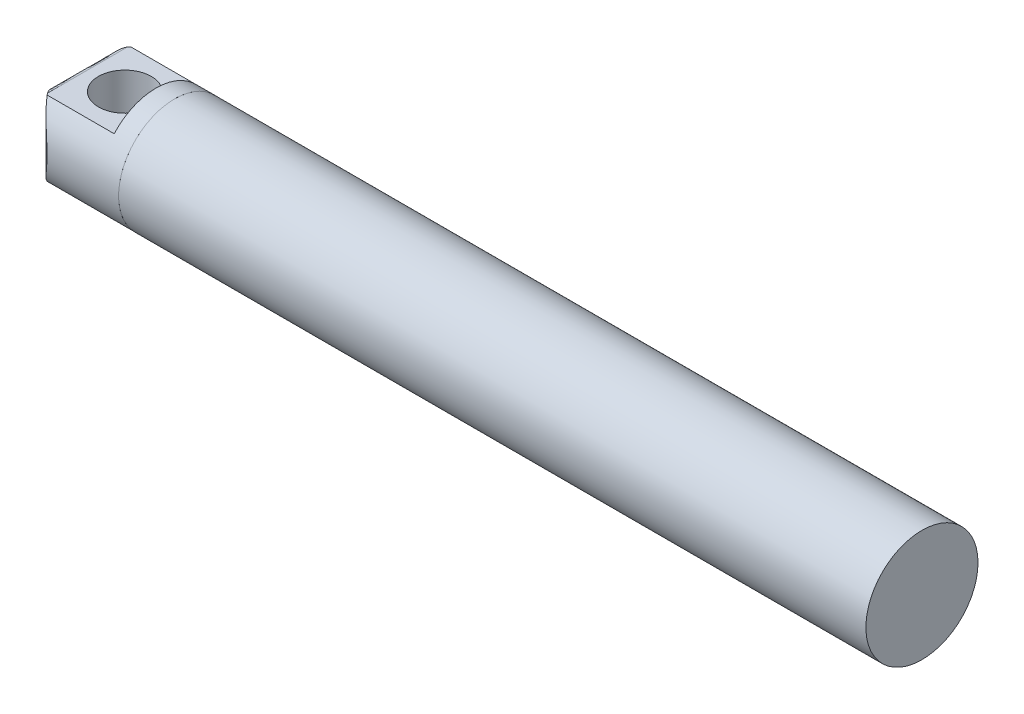
ISO-10303-21;
HEADER;
FILE_DESCRIPTION(('STEP AP214'),'2;1');
FILE_NAME('part.step','',(''),(''),'','','');
FILE_SCHEMA(('AUTOMOTIVE_DESIGN { 1 0 10303 214 1 1 1 1 }'));
ENDSEC;
DATA;
#1=APPLICATION_CONTEXT('core data for automotive mechanical design processes');
#2=APPLICATION_PROTOCOL_DEFINITION('international standard','automotive_design',2000,#1);
#3=PRODUCT_CONTEXT('',#1,'mechanical');
#4=PRODUCT('Part','Part','',(#3));
#5=PRODUCT_RELATED_PRODUCT_CATEGORY('part','',(#4));
#6=PRODUCT_DEFINITION_FORMATION('','',#4);
#7=PRODUCT_DEFINITION_CONTEXT('part definition',#1,'design');
#8=PRODUCT_DEFINITION('design','',#6,#7);
#9=PRODUCT_DEFINITION_SHAPE('','',#8);
#10=(LENGTH_UNIT() NAMED_UNIT(*) SI_UNIT(.MILLI.,.METRE.));
#11=(NAMED_UNIT(*) PLANE_ANGLE_UNIT() SI_UNIT($,.RADIAN.));
#12=(NAMED_UNIT(*) SI_UNIT($,.STERADIAN.) SOLID_ANGLE_UNIT());
#13=UNCERTAINTY_MEASURE_WITH_UNIT(LENGTH_MEASURE(1.E-05),#10,'distance_accuracy_value','');
#14=(GEOMETRIC_REPRESENTATION_CONTEXT(3) GLOBAL_UNCERTAINTY_ASSIGNED_CONTEXT((#13)) GLOBAL_UNIT_ASSIGNED_CONTEXT((#10,
#11,#12)) REPRESENTATION_CONTEXT('',''));
#15=CARTESIAN_POINT('',(0.,0.,0.));
#16=DIRECTION('',(0.,0.,1.));
#17=DIRECTION('',(1.,0.,0.));
#18=AXIS2_PLACEMENT_3D('',#15,#16,#17);
#19=CARTESIAN_POINT('',(6.87386354243376,-3.,0.));
#20=DIRECTION('',(0.,-1.,0.));
#21=DIRECTION('',(0.,0.,-1.));
#22=AXIS2_PLACEMENT_3D('',#19,#20,#21);
#23=PLANE('',#22);
#24=CARTESIAN_POINT('',(-4.,-3.,0.));
#25=DIRECTION('',(0.,-1.,0.));
#26=DIRECTION('',(0.,0.,-1.));
#27=AXIS2_PLACEMENT_3D('',#24,#25,#26);
#28=CIRCLE('',#27,2.125);
#29=CARTESIAN_POINT('',(-4.,-3.,-2.125));
#30=VERTEX_POINT('',#29);
#31=EDGE_CURVE('E138',#30,#30,#28,.T.);
#32=ORIENTED_EDGE('',*,*,#31,.F.);
#33=EDGE_LOOP('',(#32));
#34=FACE_BOUND('',#33,.T.);
#35=CARTESIAN_POINT('',(-2.375,-3.,0.));
#36=DIRECTION('',(0.,-1.,0.));
#37=DIRECTION('',(0.,0.,-1.));
#38=AXIS2_PLACEMENT_3D('',#35,#36,#37);
#39=CIRCLE('',#38,5.625);
#40=CARTESIAN_POINT('',(-7.,-3.,3.20156211871642));
#41=VERTEX_POINT('',#40);
#42=CARTESIAN_POINT('',(-6.89059796704711,-3.,3.35410196624968));
#43=VERTEX_POINT('',#42);
#44=EDGE_CURVE('E341',#41,#43,#39,.F.);
#45=ORIENTED_EDGE('',*,*,#44,.F.);
#46=CARTESIAN_POINT('',(-7.,-3.,-4.95));
#47=CARTESIAN_POINT('',(-7.,-3.,-1.65));
#48=CARTESIAN_POINT('',(-7.,-3.,1.65));
#49=CARTESIAN_POINT('',(-7.,-3.,4.95));
#50=(BOUNDED_CURVE() B_SPLINE_CURVE(3,(#46,#47,#48,#49),.UNSPECIFIED.,.F.,
.F.) B_SPLINE_CURVE_WITH_KNOTS((4,4),(-0.00495,0.00495),
.UNSPECIFIED.) CURVE() GEOMETRIC_REPRESENTATION_ITEM() RATIONAL_B_SPLINE_CURVE((1.,1.,1.,1.)) REPRESENTATION_ITEM(''));
#51=CARTESIAN_POINT('',(-7.,-3.,-3.20156211871642));
#52=VERTEX_POINT('',#51);
#53=EDGE_CURVE('E135',#41,#52,#50,.F.);
#54=ORIENTED_EDGE('',*,*,#53,.T.);
#55=CARTESIAN_POINT('',(-2.375,-3.,0.));
#56=DIRECTION('',(0.,-1.,0.));
#57=DIRECTION('',(0.,0.,-1.));
#58=AXIS2_PLACEMENT_3D('',#55,#56,#57);
#59=CIRCLE('',#58,5.625);
#60=CARTESIAN_POINT('',(-6.89059796704711,-3.,-3.35410196624968));
#61=VERTEX_POINT('',#60);
#62=EDGE_CURVE('E115',#61,#52,#59,.F.);
#63=ORIENTED_EDGE('',*,*,#62,.F.);
#64=DIRECTION('',(-1.,0.,0.));
#65=VECTOR('',#64,1.);
#66=CARTESIAN_POINT('',(6.87386354243376,-3.,-3.35410196624968));
#67=LINE('',#66,#65);
#68=CARTESIAN_POINT('',(-1.5,-3.,-3.35410196624968));
#69=VERTEX_POINT('',#68);
#70=EDGE_CURVE('E111',#69,#61,#67,.T.);
#71=ORIENTED_EDGE('',*,*,#70,.F.);
#72=DIRECTION('',(0.,0.,-1.));
#73=VECTOR('',#72,1.);
#74=CARTESIAN_POINT('',(-1.5,-3.,0.));
#75=LINE('',#74,#73);
#76=CARTESIAN_POINT('',(-1.5,-3.,3.35410196624968));
#77=VERTEX_POINT('',#76);
#78=EDGE_CURVE('E99',#77,#69,#75,.T.);
#79=ORIENTED_EDGE('',*,*,#78,.F.);
#80=DIRECTION('',(-1.,0.,0.));
#81=VECTOR('',#80,1.);
#82=CARTESIAN_POINT('',(6.87386354243376,-3.,3.35410196624968));
#83=LINE('',#82,#81);
#84=EDGE_CURVE('E107',#77,#43,#83,.T.);
#85=ORIENTED_EDGE('',*,*,#84,.T.);
#86=EDGE_LOOP('',(#45,#54,#63,#71,#79,#85));
#87=FACE_BOUND('',#86,.T.);
#88=ADVANCED_FACE('F57',(#34,#87),#23,.T.);
#89=CARTESIAN_POINT('',(6.87386354243376,3.,0.));
#90=DIRECTION('',(0.,-1.,0.));
#91=DIRECTION('',(0.,0.,-1.));
#92=AXIS2_PLACEMENT_3D('',#89,#90,#91);
#93=PLANE('',#92);
#94=CARTESIAN_POINT('',(-4.,3.,0.));
#95=DIRECTION('',(0.,-1.,0.));
#96=DIRECTION('',(0.,0.,-1.));
#97=AXIS2_PLACEMENT_3D('',#94,#95,#96);
#98=CIRCLE('',#97,2.125);
#99=CARTESIAN_POINT('',(-4.,3.,-2.125));
#100=VERTEX_POINT('',#99);
#101=EDGE_CURVE('E118',#100,#100,#98,.T.);
#102=ORIENTED_EDGE('',*,*,#101,.T.);
#103=EDGE_LOOP('',(#102));
#104=FACE_BOUND('',#103,.T.);
#105=CARTESIAN_POINT('',(-7.,3.,4.95));
#106=CARTESIAN_POINT('',(-7.,3.,1.65));
#107=CARTESIAN_POINT('',(-7.,3.,-1.65));
#108=CARTESIAN_POINT('',(-7.,3.,-4.95));
#109=(BOUNDED_CURVE() B_SPLINE_CURVE(3,(#105,#106,#107,#108),.UNSPECIFIED.,.F.,
.F.) B_SPLINE_CURVE_WITH_KNOTS((4,4),(-0.00495,0.00495),
.UNSPECIFIED.) CURVE() GEOMETRIC_REPRESENTATION_ITEM() RATIONAL_B_SPLINE_CURVE((1.,1.,1.,1.)) REPRESENTATION_ITEM(''));
#110=CARTESIAN_POINT('',(-7.,3.,-3.20156211871643));
#111=VERTEX_POINT('',#110);
#112=CARTESIAN_POINT('',(-7.,3.,3.20156211871642));
#113=VERTEX_POINT('',#112);
#114=EDGE_CURVE('E310',#111,#113,#109,.F.);
#115=ORIENTED_EDGE('',*,*,#114,.T.);
#116=CARTESIAN_POINT('',(-2.375,3.,0.));
#117=DIRECTION('',(0.,-1.,0.));
#118=DIRECTION('',(0.,0.,-1.));
#119=AXIS2_PLACEMENT_3D('',#116,#117,#118);
#120=CIRCLE('',#119,5.625);
#121=CARTESIAN_POINT('',(-6.89059796704711,3.,3.35410196624968));
#122=VERTEX_POINT('',#121);
#123=EDGE_CURVE('E78',#113,#122,#120,.F.);
#124=ORIENTED_EDGE('',*,*,#123,.T.);
#125=DIRECTION('',(-1.,0.,0.));
#126=VECTOR('',#125,1.);
#127=CARTESIAN_POINT('',(6.87386354243376,3.,3.35410196624968));
#128=LINE('',#127,#126);
#129=CARTESIAN_POINT('',(-1.5,3.,3.35410196624968));
#130=VERTEX_POINT('',#129);
#131=EDGE_CURVE('E126',#130,#122,#128,.T.);
#132=ORIENTED_EDGE('',*,*,#131,.F.);
#133=DIRECTION('',(0.,0.,-1.));
#134=VECTOR('',#133,1.);
#135=CARTESIAN_POINT('',(-1.5,3.,0.));
#136=LINE('',#135,#134);
#137=CARTESIAN_POINT('',(-1.5,3.,-3.35410196624968));
#138=VERTEX_POINT('',#137);
#139=EDGE_CURVE('E87',#130,#138,#136,.T.);
#140=ORIENTED_EDGE('',*,*,#139,.T.);
#141=DIRECTION('',(-1.,0.,0.));
#142=VECTOR('',#141,1.);
#143=CARTESIAN_POINT('',(6.87386354243376,3.,-3.35410196624968));
#144=LINE('',#143,#142);
#145=CARTESIAN_POINT('',(-6.89059796704711,3.,-3.35410196624968));
#146=VERTEX_POINT('',#145);
#147=EDGE_CURVE('E124',#138,#146,#144,.T.);
#148=ORIENTED_EDGE('',*,*,#147,.T.);
#149=CARTESIAN_POINT('',(-2.375,3.,0.));
#150=DIRECTION('',(0.,-1.,0.));
#151=DIRECTION('',(0.,0.,-1.));
#152=AXIS2_PLACEMENT_3D('',#149,#150,#151);
#153=CIRCLE('',#152,5.625);
#154=EDGE_CURVE('E279',#146,#111,#153,.F.);
#155=ORIENTED_EDGE('',*,*,#154,.T.);
#156=EDGE_LOOP('',(#115,#124,#132,#140,#148,#155));
#157=FACE_BOUND('',#156,.T.);
#158=ADVANCED_FACE('F159',(#104,#157),#93,.F.);
#159=CARTESIAN_POINT('',(-8.,0.,0.));
#160=DIRECTION('',(1.,0.,0.));
#161=DIRECTION('',(0.,0.,-1.));
#162=AXIS2_PLACEMENT_3D('',#159,#160,#161);
#163=CYLINDRICAL_SURFACE('',#162,4.5);
#164=ORIENTED_EDGE('',*,*,#131,.T.);
#165=CARTESIAN_POINT('',(-8.,4.5,0.));
#166=CARTESIAN_POINT('',(-8.0000261661008,4.50002487156967,0.108672439922456));
#167=CARTESIAN_POINT('',(-7.99685185276276,4.4960645795516,0.217328745801081));
#168=CARTESIAN_POINT('',(-7.98429829677313,4.48036197312974,0.43364470434593));
#169=CARTESIAN_POINT('',(-7.97492328388789,4.4686249635529,0.541304985716546));
#170=CARTESIAN_POINT('',(-7.95025630920092,4.43767275327524,0.754017893882866));
#171=CARTESIAN_POINT('',(-7.93500905254759,4.41851404736611,0.859083989414262));
#172=CARTESIAN_POINT('',(-7.8989397812197,4.37303995347104,1.0666829358713));
#173=CARTESIAN_POINT('',(-7.8781170806575,4.34672368495991,1.16921547342395));
#174=CARTESIAN_POINT('',(-7.83138654367935,4.28740740578871,1.37082003697381));
#175=CARTESIAN_POINT('',(-7.80549255810958,4.25442559260534,1.46990064165043));
#176=CARTESIAN_POINT('',(-7.74907704194071,4.18217468474652,1.66438967209096));
#177=CARTESIAN_POINT('',(-7.71855384501168,4.14290332580127,1.75979675996775));
#178=CARTESIAN_POINT('',(-7.62071427086776,4.01619280840778,2.04015550086476));
#179=CARTESIAN_POINT('',(-7.54717032733247,3.91991033601592,2.21906761584285));
#180=CARTESIAN_POINT('',(-7.41400776365368,3.74208663994068,2.50300782390038));
#181=CARTESIAN_POINT('',(-7.35765928887198,3.66596359520418,2.61311577806552));
#182=CARTESIAN_POINT('',(-7.24077925728615,3.50545479990695,2.82478438679524));
#183=CARTESIAN_POINT('',(-7.18024773418259,3.42106911591153,2.92634511020561));
#184=CARTESIAN_POINT('',(-7.05616873846176,3.24448393969402,3.12100163484433));
#185=CARTESIAN_POINT('',(-6.99261353003736,3.15226387226424,3.21407372633282));
#186=CARTESIAN_POINT('',(-6.86402643681371,2.9607052493104,3.39134893405051));
#187=CARTESIAN_POINT('',(-6.79899514309824,2.86136950999452,3.47555552679283));
#188=CARTESIAN_POINT('',(-6.66786388809714,2.65416610852393,3.63632686992106));
#189=CARTESIAN_POINT('',(-6.60176339468885,2.54618779917114,3.712748629409));
#190=CARTESIAN_POINT('',(-6.47126926601441,2.32314199763701,3.8562425409141));
#191=CARTESIAN_POINT('',(-6.4068761761314,2.2080722784033,3.92331173396583));
#192=CARTESIAN_POINT('',(-6.28212790298923,1.97107666184142,4.04755486354508));
#193=CARTESIAN_POINT('',(-6.22176202835472,1.84917063997277,4.10475569649702));
#194=CARTESIAN_POINT('',(-6.1076087182825,1.59819949905376,4.20882590894756));
#195=CARTESIAN_POINT('',(-6.0538156794043,1.46914061632435,4.25570411638028));
#196=CARTESIAN_POINT('',(-5.94878886929489,1.1837991495072,4.34443093288057));
#197=CARTESIAN_POINT('',(-5.89913843095813,1.02633016672769,4.3844814767026));
#198=CARTESIAN_POINT('',(-5.83904774924775,0.784290990483122,4.43188997598468));
#199=CARTESIAN_POINT('',(-5.82142186278368,0.702693989221956,4.44557676350451));
#200=CARTESIAN_POINT('',(-5.79163831630602,0.537908696939688,4.46850787740056));
#201=CARTESIAN_POINT('',(-5.77947792321641,0.454721222996837,4.47775442432328));
#202=CARTESIAN_POINT('',(-5.76109976436353,0.286524941048153,4.49166889700138));
#203=CARTESIAN_POINT('',(-5.75493766398534,0.201506419458626,4.49629394457043));
#204=CARTESIAN_POINT('',(-5.74906972271404,0.0311215371337521,4.50069912166866));
#205=CARTESIAN_POINT('',(-5.74936356323163,-0.0542448062293438,4.50047949027422));
#206=CARTESIAN_POINT('',(-5.75639368743091,-0.224602881980737,4.49519969305009));
#207=CARTESIAN_POINT('',(-5.76313338557733,-0.309594391842028,4.49013696175948));
#208=CARTESIAN_POINT('',(-5.78271599618316,-0.478484799420624,4.47529282126764));
#209=CARTESIAN_POINT('',(-5.79556215027681,-0.562383092467276,4.4655089057669));
#210=CARTESIAN_POINT('',(-5.82919455900568,-0.741434965725223,4.43955869719676));
#211=CARTESIAN_POINT('',(-5.85090630117247,-0.836304684188569,4.42263531536983));
#212=CARTESIAN_POINT('',(-5.90054851484273,-1.02323008253987,4.38316564029135));
#213=CARTESIAN_POINT('',(-5.92848362566582,-1.1152836045149,4.36061515069935));
#214=CARTESIAN_POINT('',(-6.01991290651878,-1.38707045335151,4.28502580284268));
#215=CARTESIAN_POINT('',(-6.09096633764061,-1.56212336814309,4.22409562862079));
#216=CARTESIAN_POINT('',(-6.22506502478741,-1.85603168983297,4.10166808565762));
#217=CARTESIAN_POINT('',(-6.28555954648743,-1.97786670191742,4.04424657199999));
#218=CARTESIAN_POINT('',(-6.41040539719526,-2.21449049514367,3.91968092163188));
#219=CARTESIAN_POINT('',(-6.4747585016677,-2.32927598261877,3.85253228870846));
#220=CARTESIAN_POINT('',(-6.60522718705313,-2.55192894829102,3.70880611531807));
#221=CARTESIAN_POINT('',(-6.67134479214373,-2.65978795120054,3.63221734605303));
#222=CARTESIAN_POINT('',(-6.80350788199198,-2.86837215736219,3.46985600027281));
#223=CARTESIAN_POINT('',(-6.86955337687331,-2.96909853812568,3.38408494554434));
#224=CARTESIAN_POINT('',(-7.00179089672534,-3.1657547506825,3.20101850928736));
#225=CARTESIAN_POINT('',(-7.06793973787145,-3.26148466864229,3.10347654684732));
#226=CARTESIAN_POINT('',(-7.19701960206948,-3.44462830671523,2.89886039491093));
#227=CARTESIAN_POINT('',(-7.25995013228855,-3.53204075489422,2.79178475232449));
#228=CARTESIAN_POINT('',(-7.38094837656211,-3.69757703194077,2.56849759597405));
#229=CARTESIAN_POINT('',(-7.43902625718152,-3.77572043194652,2.45230622431923));
#230=CARTESIAN_POINT('',(-7.54892283765363,-3.92188319996621,2.21105075338405));
#231=CARTESIAN_POINT('',(-7.60074450313563,-3.98990736837166,2.08599090300591));
#232=CARTESIAN_POINT('',(-7.71705925753282,-4.14128430859407,1.7724231705272));
#233=CARTESIAN_POINT('',(-7.77759057251411,-4.21888269283898,1.57952084760284));
#234=CARTESIAN_POINT('',(-7.85332276947795,-4.31529563733404,1.28032523371139));
#235=CARTESIAN_POINT('',(-7.87604793706609,-4.34409248450541,1.17900959719902));
#236=CARTESIAN_POINT('',(-7.91608660397593,-4.39468518863303,0.973608526905847));
#237=CARTESIAN_POINT('',(-7.93340176766953,-4.41648319881818,0.869523955694167));
#238=CARTESIAN_POINT('',(-7.96501040391153,-4.45620518089249,0.639056693083048));
#239=CARTESIAN_POINT('',(-7.97808537833726,-4.47258174110641,0.512229785993068));
#240=CARTESIAN_POINT('',(-7.99120914316473,-4.48900761024307,0.320825640382829));
#241=CARTESIAN_POINT('',(-7.99450231178815,-4.49312643301584,0.256780645820061));
#242=CARTESIAN_POINT('',(-7.99889853224633,-4.49862325987034,0.128495178120196));
#243=CARTESIAN_POINT('',(-8.00000147759835,-4.50000113069439,0.0642546956310645));
#244=CARTESIAN_POINT('',(-8.,-4.5,0.));
#245=B_SPLINE_CURVE_WITH_KNOTS('',3,(#165,#166,#167,#168,#169,#170,#171,#172,#173,#174,#175,
#176,#177,#178,#179,#180,#181,#182,#183,#184,#185,#186,#187,#188,#189,#190,#191,#192,#193,#194,
#195,#196,#197,#198,#199,#200,#201,#202,#203,#204,#205,#206,#207,#208,#209,#210,#211,#212,#213,
#214,#215,#216,#217,#218,#219,#220,#221,#222,#223,#224,#225,#226,#227,#228,#229,#230,#231,#232,
#233,#234,#235,#236,#237,#238,#239,#240,#241,#242,#243,#244),.UNSPECIFIED.,.F.,.F.,(4,2,2,2,2,2,
2,2,2,2,2,2,2,2,2,2,2,2,2,2,2,2,2,2,2,2,2,2,2,2,2,2,2,2,2,2,2,2,2,4),(0.,0.325873390537367,
0.651524717634366,0.974744375261115,1.2980038134525,1.6203923679153,1.94289724593747,
2.58846980258137,3.02370253883476,3.45893176906262,3.89534162565577,4.33157970620457,
4.77476231285281,5.21808481704872,5.66017926302322,6.10189414760313,6.60960830761901,
6.86313355272992,7.11653187850242,7.37225998776166,7.62797547731773,7.88382649816316,
8.13981349038544,8.4356990444293,8.73180591406933,9.32495860391734,9.7674351449928,
10.2101168706435,10.6533303303863,11.0964704494284,11.5514441144277,12.0064872440151,
12.4605517924078,12.9144002486499,13.560943823822,13.8838717286897,14.2067001876843,
14.5915126197412,14.7842151368725,14.97692702245),.UNSPECIFIED.);
#246=EDGE_CURVE('E340',#122,#43,#245,.T.);
#247=ORIENTED_EDGE('',*,*,#246,.T.);
#248=ORIENTED_EDGE('',*,*,#84,.F.);
#249=CARTESIAN_POINT('',(-1.5,0.,0.));
#250=DIRECTION('',(-1.,0.,0.));
#251=DIRECTION('',(0.,0.,1.));
#252=AXIS2_PLACEMENT_3D('',#249,#250,#251);
#253=CIRCLE('',#252,4.5);
#254=EDGE_CURVE('E103',#77,#69,#253,.F.);
#255=ORIENTED_EDGE('',*,*,#254,.T.);
#256=ORIENTED_EDGE('',*,*,#70,.T.);
#257=CARTESIAN_POINT('',(-8.,-4.5,0.));
#258=CARTESIAN_POINT('',(-8.0000261661008,-4.50002487156967,-0.108672439922454));
#259=CARTESIAN_POINT('',(-7.99685185276276,-4.4960645795516,-0.217328745801079));
#260=CARTESIAN_POINT('',(-7.98429829677313,-4.48036197312974,-0.433644704345927));
#261=CARTESIAN_POINT('',(-7.97492328388789,-4.4686249635529,-0.541304985716544));
#262=CARTESIAN_POINT('',(-7.95025630920092,-4.43767275327524,-0.754017893882863));
#263=CARTESIAN_POINT('',(-7.93500905254759,-4.41851404736611,-0.859083989414259));
#264=CARTESIAN_POINT('',(-7.8989397812197,-4.37303995347104,-1.06668293587129));
#265=CARTESIAN_POINT('',(-7.8781170806575,-4.34672368495991,-1.16921547342395));
#266=CARTESIAN_POINT('',(-7.83138654367935,-4.28740740578871,-1.3708200369738));
#267=CARTESIAN_POINT('',(-7.80549255810958,-4.25442559260535,-1.46990064165042));
#268=CARTESIAN_POINT('',(-7.74907704194071,-4.18217468474652,-1.66438967209096));
#269=CARTESIAN_POINT('',(-7.71855384501168,-4.14290332580127,-1.75979675996775));
#270=CARTESIAN_POINT('',(-7.62071427086776,-4.01619280840779,-2.04015550086476));
#271=CARTESIAN_POINT('',(-7.54717032733247,-3.91991033601592,-2.21906761584285));
#272=CARTESIAN_POINT('',(-7.41400776365368,-3.74208663994068,-2.50300782390038));
#273=CARTESIAN_POINT('',(-7.35765928887198,-3.66596359520419,-2.61311577806552));
#274=CARTESIAN_POINT('',(-7.24077925728615,-3.50545479990695,-2.82478438679524));
#275=CARTESIAN_POINT('',(-7.18024773418259,-3.42106911591153,-2.92634511020561));
#276=CARTESIAN_POINT('',(-7.05616873846176,-3.24448393969402,-3.12100163484433));
#277=CARTESIAN_POINT('',(-6.99261353003736,-3.15226387226425,-3.21407372633282));
#278=CARTESIAN_POINT('',(-6.86402643681371,-2.9607052493104,-3.3913489340505));
#279=CARTESIAN_POINT('',(-6.79899514309824,-2.86136950999452,-3.47555552679283));
#280=CARTESIAN_POINT('',(-6.66786388809714,-2.65416610852393,-3.63632686992105));
#281=CARTESIAN_POINT('',(-6.60176339468886,-2.54618779917114,-3.712748629409));
#282=CARTESIAN_POINT('',(-6.47126926601441,-2.32314199763701,-3.8562425409141));
#283=CARTESIAN_POINT('',(-6.4068761761314,-2.2080722784033,-3.92331173396583));
#284=CARTESIAN_POINT('',(-6.28212790298923,-1.97107666184143,-4.04755486354508));
#285=CARTESIAN_POINT('',(-6.22176202835472,-1.84917063997277,-4.10475569649702));
#286=CARTESIAN_POINT('',(-6.1076087182825,-1.59819949905377,-4.20882590894756));
#287=CARTESIAN_POINT('',(-6.05381567940431,-1.46914061632435,-4.25570411638028));
#288=CARTESIAN_POINT('',(-5.94878886929489,-1.1837991495072,-4.34443093288057));
#289=CARTESIAN_POINT('',(-5.89913843095813,-1.02633016672769,-4.3844814767026));
#290=CARTESIAN_POINT('',(-5.83904774924775,-0.784290990483127,-4.43188997598468));
#291=CARTESIAN_POINT('',(-5.82142186278368,-0.70269398922196,-4.44557676350451));
#292=CARTESIAN_POINT('',(-5.79163831630602,-0.537908696939691,-4.46850787740056));
#293=CARTESIAN_POINT('',(-5.77947792321641,-0.45472122299684,-4.47775442432328));
#294=CARTESIAN_POINT('',(-5.76109976436353,-0.286524941048156,-4.49166889700138));
#295=CARTESIAN_POINT('',(-5.75493766398534,-0.201506419458629,-4.49629394457043));
#296=CARTESIAN_POINT('',(-5.74906972271404,-0.0311215371337546,-4.50069912166866));
#297=CARTESIAN_POINT('',(-5.74936356323163,0.0542448062293415,-4.50047949027422));
#298=CARTESIAN_POINT('',(-5.75639368743091,0.224602881980735,-4.49519969305009));
#299=CARTESIAN_POINT('',(-5.76313338557733,0.309594391842026,-4.49013696175948));
#300=CARTESIAN_POINT('',(-5.78271599618316,0.478484799420622,-4.47529282126764));
#301=CARTESIAN_POINT('',(-5.79556215027681,0.562383092467275,-4.4655089057669));
#302=CARTESIAN_POINT('',(-5.82919455900568,0.741434965725221,-4.43955869719676));
#303=CARTESIAN_POINT('',(-5.85090630117246,0.836304684188567,-4.42263531536983));
#304=CARTESIAN_POINT('',(-5.90054851484273,1.02323008253987,-4.38316564029135));
#305=CARTESIAN_POINT('',(-5.92848362566582,1.1152836045149,-4.36061515069935));
#306=CARTESIAN_POINT('',(-6.01991290651878,1.38707045335151,-4.28502580284268));
#307=CARTESIAN_POINT('',(-6.09096633764061,1.56212336814308,-4.22409562862079));
#308=CARTESIAN_POINT('',(-6.22506502478741,1.85603168983297,-4.10166808565762));
#309=CARTESIAN_POINT('',(-6.28555954648743,1.97786670191742,-4.044246572));
#310=CARTESIAN_POINT('',(-6.41040539719526,2.21449049514367,-3.91968092163188));
#311=CARTESIAN_POINT('',(-6.4747585016677,2.32927598261876,-3.85253228870846));
#312=CARTESIAN_POINT('',(-6.60522718705313,2.55192894829102,-3.70880611531807));
#313=CARTESIAN_POINT('',(-6.67134479214373,2.65978795120054,-3.63221734605303));
#314=CARTESIAN_POINT('',(-6.80350788199198,2.86837215736219,-3.46985600027281));
#315=CARTESIAN_POINT('',(-6.86955337687331,2.96909853812568,-3.38408494554434));
#316=CARTESIAN_POINT('',(-7.00179089672534,3.16575475068249,-3.20101850928736));
#317=CARTESIAN_POINT('',(-7.06793973787145,3.26148466864229,-3.10347654684732));
#318=CARTESIAN_POINT('',(-7.19701960206948,3.44462830671523,-2.89886039491093));
#319=CARTESIAN_POINT('',(-7.25995013228855,3.53204075489422,-2.79178475232449));
#320=CARTESIAN_POINT('',(-7.38094837656211,3.69757703194076,-2.56849759597406));
#321=CARTESIAN_POINT('',(-7.43902625718151,3.77572043194652,-2.45230622431923));
#322=CARTESIAN_POINT('',(-7.54892283765363,3.9218831999662,-2.21105075338405));
#323=CARTESIAN_POINT('',(-7.60074450313563,3.98990736837166,-2.08599090300592));
#324=CARTESIAN_POINT('',(-7.71705925753281,4.14128430859407,-1.7724231705272));
#325=CARTESIAN_POINT('',(-7.7775905725141,4.21888269283898,-1.57952084760285));
#326=CARTESIAN_POINT('',(-7.85332276947794,4.31529563733404,-1.2803252337114));
#327=CARTESIAN_POINT('',(-7.87604793706609,4.34409248450541,-1.17900959719903));
#328=CARTESIAN_POINT('',(-7.91608660397593,4.39468518863303,-0.973608526905851));
#329=CARTESIAN_POINT('',(-7.93340176766953,4.41648319881818,-0.869523955694171));
#330=CARTESIAN_POINT('',(-7.96501040391153,4.45620518089249,-0.639056693083051));
#331=CARTESIAN_POINT('',(-7.97808537833726,4.47258174110641,-0.51222978599307));
#332=CARTESIAN_POINT('',(-7.99120914316473,4.48900761024307,-0.32082564038283));
#333=CARTESIAN_POINT('',(-7.99450231178815,4.49312643301584,-0.256780645820061));
#334=CARTESIAN_POINT('',(-7.99889853224633,4.49862325987034,-0.128495178120196));
#335=CARTESIAN_POINT('',(-8.00000147759835,4.50000113069439,-0.0642546956310641));
#336=CARTESIAN_POINT('',(-8.,4.5,0.));
#337=B_SPLINE_CURVE_WITH_KNOTS('',3,(#257,#258,#259,#260,#261,#262,#263,#264,#265,#266,#267,
#268,#269,#270,#271,#272,#273,#274,#275,#276,#277,#278,#279,#280,#281,#282,#283,#284,#285,#286,
#287,#288,#289,#290,#291,#292,#293,#294,#295,#296,#297,#298,#299,#300,#301,#302,#303,#304,#305,
#306,#307,#308,#309,#310,#311,#312,#313,#314,#315,#316,#317,#318,#319,#320,#321,#322,#323,#324,
#325,#326,#327,#328,#329,#330,#331,#332,#333,#334,#335,#336),.UNSPECIFIED.,.F.,.F.,(4,2,2,2,2,2,
2,2,2,2,2,2,2,2,2,2,2,2,2,2,2,2,2,2,2,2,2,2,2,2,2,2,2,2,2,2,2,2,2,4),(0.,0.325873390537366,
0.651524717634366,0.974744375261114,1.2980038134525,1.6203923679153,1.94289724593747,
2.58846980258137,3.02370253883476,3.45893176906262,3.89534162565577,4.33157970620456,
4.77476231285281,5.21808481704872,5.66017926302322,6.10189414760313,6.60960830761901,
6.86313355272992,7.11653187850242,7.37225998776166,7.62797547731773,7.88382649816316,
8.13981349038544,8.4356990444293,8.73180591406933,9.32495860391734,9.7674351449928,
10.2101168706435,10.6533303303863,11.0964704494284,11.5514441144277,12.0064872440151,
12.4605517924078,12.9144002486499,13.560943823822,13.8838717286897,14.2067001876843,
14.5915126197412,14.7842151368725,14.97692702245),.UNSPECIFIED.);
#338=EDGE_CURVE('E285',#61,#146,#337,.T.);
#339=ORIENTED_EDGE('',*,*,#338,.T.);
#340=ORIENTED_EDGE('',*,*,#147,.F.);
#341=CARTESIAN_POINT('',(-1.5,0.,0.));
#342=DIRECTION('',(-1.,0.,0.));
#343=DIRECTION('',(0.,0.,1.));
#344=AXIS2_PLACEMENT_3D('',#341,#342,#343);
#345=CIRCLE('',#344,4.5);
#346=EDGE_CURVE('E143',#138,#130,#345,.F.);
#347=ORIENTED_EDGE('',*,*,#346,.T.);
#348=EDGE_LOOP('',(#164,#247,#248,#255,#256,#339,#340,#347));
#349=FACE_BOUND('',#348,.T.);
#350=CARTESIAN_POINT('',(0.,0.,0.));
#351=DIRECTION('',(-1.,0.,0.));
#352=DIRECTION('',(0.,0.,1.));
#353=AXIS2_PLACEMENT_3D('',#350,#351,#352);
#354=CIRCLE('',#353,4.5);
#355=CARTESIAN_POINT('',(0.,0.,4.5));
#356=VERTEX_POINT('',#355);
#357=EDGE_CURVE('E132',#356,#356,#354,.T.);
#358=ORIENTED_EDGE('',*,*,#357,.T.);
#359=EDGE_LOOP('',(#358));
#360=FACE_BOUND('',#359,.T.);
#361=ADVANCED_FACE('F121',(#349,#360),#163,.T.);
#362=CARTESIAN_POINT('',(0.,0.,0.));
#363=DIRECTION('',(-1.,0.,0.));
#364=DIRECTION('',(0.,0.,1.));
#365=AXIS2_PLACEMENT_3D('',#362,#363,#364);
#366=PLANE('',#365);
#367=ORIENTED_EDGE('',*,*,#357,.F.);
#368=EDGE_LOOP('',(#367));
#369=FACE_BOUND('',#368,.T.);
#370=ADVANCED_FACE('F174',(#369),#366,.F.);
#371=CARTESIAN_POINT('',(-1.5,0.,0.));
#372=DIRECTION('',(-1.,0.,0.));
#373=DIRECTION('',(0.,0.,1.));
#374=AXIS2_PLACEMENT_3D('',#371,#372,#373);
#375=PLANE('',#374);
#376=ORIENTED_EDGE('',*,*,#254,.F.);
#377=ORIENTED_EDGE('',*,*,#78,.T.);
#378=EDGE_LOOP('',(#376,#377));
#379=FACE_BOUND('',#378,.T.);
#380=ADVANCED_FACE('F101',(#379),#375,.T.);
#381=CARTESIAN_POINT('',(-1.5,0.,0.));
#382=DIRECTION('',(-1.,0.,0.));
#383=DIRECTION('',(0.,0.,1.));
#384=AXIS2_PLACEMENT_3D('',#381,#382,#383);
#385=PLANE('',#384);
#386=ORIENTED_EDGE('',*,*,#346,.F.);
#387=ORIENTED_EDGE('',*,*,#139,.F.);
#388=EDGE_LOOP('',(#386,#387));
#389=FACE_BOUND('',#388,.T.);
#390=ADVANCED_FACE('F170',(#389),#385,.T.);
#391=CARTESIAN_POINT('',(-4.,4.5,0.));
#392=DIRECTION('',(0.,-1.,0.));
#393=DIRECTION('',(0.,0.,-1.));
#394=AXIS2_PLACEMENT_3D('',#391,#392,#393);
#395=CYLINDRICAL_SURFACE('',#394,2.125);
#396=ORIENTED_EDGE('',*,*,#31,.T.);
#397=EDGE_LOOP('',(#396));
#398=FACE_BOUND('',#397,.T.);
#399=ORIENTED_EDGE('',*,*,#101,.F.);
#400=EDGE_LOOP('',(#399));
#401=FACE_BOUND('',#400,.T.);
#402=ADVANCED_FACE('F223',(#398,#401),#395,.F.);
#403=CARTESIAN_POINT('',(-8.,0.,-4.95));
#404=CARTESIAN_POINT('',(-8.,0.,-1.65));
#405=CARTESIAN_POINT('',(-8.,0.,1.65));
#406=CARTESIAN_POINT('',(-8.,0.,4.95));
#407=CARTESIAN_POINT('',(-8.,-3.,-4.95));
#408=CARTESIAN_POINT('',(-8.,-3.,-1.65));
#409=CARTESIAN_POINT('',(-8.,-3.,1.65));
#410=CARTESIAN_POINT('',(-8.,-3.,4.95));
#411=CARTESIAN_POINT('',(-7.,-3.,-4.95));
#412=CARTESIAN_POINT('',(-7.,-3.,-1.65));
#413=CARTESIAN_POINT('',(-7.,-3.,1.65));
#414=CARTESIAN_POINT('',(-7.,-3.,4.95));
#415=(BOUNDED_SURFACE() B_SPLINE_SURFACE(2,3,((#403,#404,#405,#406),(#407,#408,#409,#410),(#411,
#412,#413,#414)),.UNSPECIFIED.,.F.,.F.,.F.) B_SPLINE_SURFACE_WITH_KNOTS((3,3),(4,4),(0.,1.),
(-0.00495,0.00495),
.UNSPECIFIED.) GEOMETRIC_REPRESENTATION_ITEM() RATIONAL_B_SPLINE_SURFACE(((1.,1.,1.,1.),
(0.707106781186548,0.707106781186548,0.707106781186548,0.707106781186548),(1.,1.,1.,1.))) REPRESENTATION_ITEM('') SURFACE());
#416=CARTESIAN_POINT('',(-7.,-3.,3.20156211871642));
#417=CARTESIAN_POINT('',(-7.03236832458521,-3.00001999319289,3.15483054416643));
#418=CARTESIAN_POINT('',(-7.06386874306515,-2.99529017516387,3.10778414198009));
#419=CARTESIAN_POINT('',(-7.12447778880159,-2.97804493020909,3.01431650065035));
#420=CARTESIAN_POINT('',(-7.15360963568613,-2.96561909572023,2.96789426141037));
#421=CARTESIAN_POINT('',(-7.20655169438404,-2.93629868199439,2.88080890125299));
#422=CARTESIAN_POINT('',(-7.23059667417074,-2.92003294313545,2.84006603019509));
#423=CARTESIAN_POINT('',(-7.27692880176442,-2.88356602776757,2.75932648882784));
#424=CARTESIAN_POINT('',(-7.29921481451605,-2.86336233881626,2.71933031286186));
#425=CARTESIAN_POINT('',(-7.34227317244633,-2.81963324533846,2.63986417575268));
#426=CARTESIAN_POINT('',(-7.36303203412824,-2.796082643774,2.60040095158735));
#427=CARTESIAN_POINT('',(-7.40296351281597,-2.74641294937646,2.52232617407461));
#428=CARTESIAN_POINT('',(-7.42213647020755,-2.72029441035255,2.48371443928196));
#429=CARTESIAN_POINT('',(-7.46491269523587,-2.65731510478651,2.39510899989731));
#430=CARTESIAN_POINT('',(-7.48798180938816,-2.61968265861576,2.34540743952579));
#431=CARTESIAN_POINT('',(-7.53188468852034,-2.54160118646665,2.24723255441383));
#432=CARTESIAN_POINT('',(-7.55271746284007,-2.50115092522072,2.19875978120827));
#433=CARTESIAN_POINT('',(-7.61228117625529,-2.3763879334239,2.05483114828513));
#434=CARTESIAN_POINT('',(-7.64801228739268,-2.28876468818272,1.96100210881465));
#435=CARTESIAN_POINT('',(-7.71298681666845,-2.10772627413457,1.77653691849953));
#436=CARTESIAN_POINT('',(-7.74221846426807,-2.01430098286761,1.68590680654659));
#437=CARTESIAN_POINT('',(-7.79510118850916,-1.82364568093808,1.50724754652073));
#438=CARTESIAN_POINT('',(-7.81875686226426,-1.72641888208733,1.41921630856074));
#439=CARTESIAN_POINT('',(-7.8586546195411,-1.54112138526381,1.25553524990166));
#440=CARTESIAN_POINT('',(-7.87544620354656,-1.45335622231669,1.17966990299074));
#441=CARTESIAN_POINT('',(-7.90559961031484,-1.27627420658548,1.02906916096807));
#442=CARTESIAN_POINT('',(-7.91896106033807,-1.18695718629197,0.95433388948703));
#443=CARTESIAN_POINT('',(-7.95422577171523,-0.917770721614861,0.731749960185313));
#444=CARTESIAN_POINT('',(-7.97139902365735,-0.73623224981636,0.585147217190732));
#445=CARTESIAN_POINT('',(-7.98841602957159,-0.464263048635389,0.367830137520758));
#446=CARTESIAN_POINT('',(-7.99263114514254,-0.374543403861303,0.296511107133569));
#447=CARTESIAN_POINT('',(-7.99834286569715,-0.194844335828985,0.154047757419146));
#448=CARTESIAN_POINT('',(-7.99983900358965,-0.10486487059508,0.0829034702068963));
#449=CARTESIAN_POINT('',(-7.99999589070238,-0.00992276615822732,0.00784463868301938));
#450=CARTESIAN_POINT('',(-7.99999999258424,-0.00496137484307822,0.00392231466259599));
#451=CARTESIAN_POINT('',(-8.,0.,0.));
#452=B_SPLINE_CURVE_WITH_KNOTS('',3,(#416,#417,#418,#419,#420,#421,#422,#423,#424,#425,#426,
#427,#428,#429,#430,#431,#432,#433,#434,#435,#436,#437,#438,#439,#440,#441,#442,#443,#444,#445,
#446,#447,#448,#449,#450,#451),.UNSPECIFIED.,.F.,.F.,(4,2,2,2,2,2,2,2,2,2,2,2,2,2,2,2,2,4),(0.,
0.169998903161114,0.33805504188558,0.487931029101642,0.637902953210587,0.789070469602154,
0.940205455964252,1.13948197157798,1.33884640211887,1.73812101566532,2.13811293083906,
2.53777390998813,2.88935738644857,3.24097905198921,3.94248262962906,4.28653380687461,
4.63064408283287,4.64961775278576),.UNSPECIFIED.);
#453=CARTESIAN_POINT('',(-8.,0.,0.));
#454=VERTEX_POINT('',#453);
#455=EDGE_CURVE('E213',#454,#41,#452,.F.);
#456=CARTESIAN_POINT('',(-7.,-3.,-3.20156211871642));
#457=CARTESIAN_POINT('',(-7.03236832458521,-3.00001999319289,-3.15483054416642));
#458=CARTESIAN_POINT('',(-7.06386874306515,-2.99529017516387,-3.10778414198009));
#459=CARTESIAN_POINT('',(-7.12447778880159,-2.97804493020909,-3.01431650065036));
#460=CARTESIAN_POINT('',(-7.15360963568614,-2.96561909572023,-2.96789426141038));
#461=CARTESIAN_POINT('',(-7.20655169438404,-2.93629868199439,-2.880808901253));
#462=CARTESIAN_POINT('',(-7.23059667417074,-2.92003294313545,-2.84006603019509));
#463=CARTESIAN_POINT('',(-7.27692880176442,-2.88356602776757,-2.75932648882783));
#464=CARTESIAN_POINT('',(-7.29921481451605,-2.86336233881626,-2.71933031286186));
#465=CARTESIAN_POINT('',(-7.34227317244633,-2.81963324533846,-2.63986417575268));
#466=CARTESIAN_POINT('',(-7.36303203412824,-2.796082643774,-2.60040095158735));
#467=CARTESIAN_POINT('',(-7.40296351281597,-2.74641294937646,-2.5223261740746));
#468=CARTESIAN_POINT('',(-7.42213647020755,-2.72029441035254,-2.48371443928196));
#469=CARTESIAN_POINT('',(-7.46491269523588,-2.65731510478651,-2.3951089998973));
#470=CARTESIAN_POINT('',(-7.48798180938816,-2.61968265861576,-2.34540743952578));
#471=CARTESIAN_POINT('',(-7.53188468852034,-2.54160118646664,-2.24723255441383));
#472=CARTESIAN_POINT('',(-7.55271746284007,-2.50115092522071,-2.19875978120826));
#473=CARTESIAN_POINT('',(-7.61228117625529,-2.37638793342388,-2.05483114828512));
#474=CARTESIAN_POINT('',(-7.64801228739269,-2.28876468818271,-1.96100210881464));
#475=CARTESIAN_POINT('',(-7.71298681666845,-2.10772627413456,-1.77653691849951));
#476=CARTESIAN_POINT('',(-7.74221846426803,-2.0143009828676,-1.68590680654656));
#477=CARTESIAN_POINT('',(-7.7951011885092,-1.82364568093807,-1.50724754652071));
#478=CARTESIAN_POINT('',(-7.8187568622644,-1.72641888208731,-1.41921630856076));
#479=CARTESIAN_POINT('',(-7.85865461954122,-1.5411213852638,-1.25553524990167));
#480=CARTESIAN_POINT('',(-7.8754462035466,-1.45335622231667,-1.17966990299073));
#481=CARTESIAN_POINT('',(-7.90559961031482,-1.27627420658545,-1.02906916096803));
#482=CARTESIAN_POINT('',(-7.91896106033806,-1.18695718629194,-0.954333889486983));
#483=CARTESIAN_POINT('',(-7.95422577171526,-0.917770721614823,-0.731749960185269));
#484=CARTESIAN_POINT('',(-7.97139902365735,-0.736232249816278,-0.58514721719072));
#485=CARTESIAN_POINT('',(-7.98841602957159,-0.464263048635353,-0.36783013752069));
#486=CARTESIAN_POINT('',(-7.99263114514254,-0.374543403861308,-0.296511107133472));
#487=CARTESIAN_POINT('',(-7.99834286569716,-0.194844335828931,-0.154047757419165));
#488=CARTESIAN_POINT('',(-7.99983900358966,-0.104864870594928,-0.0829034702070621));
#489=CARTESIAN_POINT('',(-7.99999589070238,-0.0099227661582104,-0.00784463868303705));
#490=CARTESIAN_POINT('',(-7.99999999258424,-0.00496137484306938,-0.00392231466260529));
#491=CARTESIAN_POINT('',(-8.,0.,0.));
#492=B_SPLINE_CURVE_WITH_KNOTS('',3,(#456,#457,#458,#459,#460,#461,#462,#463,#464,#465,#466,
#467,#468,#469,#470,#471,#472,#473,#474,#475,#476,#477,#478,#479,#480,#481,#482,#483,#484,#485,
#486,#487,#488,#489,#490,#491),.UNSPECIFIED.,.F.,.F.,(4,2,2,2,2,2,2,2,2,2,2,2,2,2,2,2,2,4),(0.,
0.169998903161112,0.33805504188558,0.487931029101644,0.637902953210591,0.789070469602162,
0.940205455964262,1.13948197157799,1.33884640211889,1.73812101566534,2.13811293083908,
2.53777390998816,2.88935738644861,3.24097905198927,3.94248262962915,4.28653380687466,
4.63064408283287,4.64961775278577),.UNSPECIFIED.);
#493=EDGE_CURVE('E278',#52,#454,#492,.T.);
#494=ORIENTED_EDGE('',*,*,#455,.F.);
#495=ORIENTED_EDGE('',*,*,#493,.F.);
#496=ORIENTED_EDGE('',*,*,#53,.F.);
#497=EDGE_LOOP('',(#494,#495,#496));
#498=FACE_BOUND('',#497,.T.);
#499=ADVANCED_FACE('F216',(#498),#415,.T.);
#500=CARTESIAN_POINT('',(-8.,0.,4.95));
#501=CARTESIAN_POINT('',(-8.,0.,1.65));
#502=CARTESIAN_POINT('',(-8.,0.,-1.65));
#503=CARTESIAN_POINT('',(-8.,0.,-4.95));
#504=CARTESIAN_POINT('',(-8.,3.,4.95));
#505=CARTESIAN_POINT('',(-8.,3.,1.65));
#506=CARTESIAN_POINT('',(-8.,3.,-1.65));
#507=CARTESIAN_POINT('',(-8.,3.,-4.95));
#508=CARTESIAN_POINT('',(-7.,3.,4.95));
#509=CARTESIAN_POINT('',(-7.,3.,1.65));
#510=CARTESIAN_POINT('',(-7.,3.,-1.65));
#511=CARTESIAN_POINT('',(-7.,3.,-4.95));
#512=(BOUNDED_SURFACE() B_SPLINE_SURFACE(2,3,((#500,#501,#502,#503),(#504,#505,#506,#507),(#508,
#509,#510,#511)),.UNSPECIFIED.,.F.,.F.,.F.) B_SPLINE_SURFACE_WITH_KNOTS((3,3),(4,4),(0.,1.),
(-0.00495,0.00495),
.UNSPECIFIED.) GEOMETRIC_REPRESENTATION_ITEM() RATIONAL_B_SPLINE_SURFACE(((1.,1.,1.,1.),
(0.707106781186548,0.707106781186548,0.707106781186548,0.707106781186548),(1.,1.,1.,1.))) REPRESENTATION_ITEM('') SURFACE());
#513=CARTESIAN_POINT('',(-7.,3.,3.20156211871643));
#514=CARTESIAN_POINT('',(-7.0323683245852,3.0000199931929,3.15483054416643));
#515=CARTESIAN_POINT('',(-7.06386874306514,2.99529017516387,3.1077841419801));
#516=CARTESIAN_POINT('',(-7.12447778880158,2.97804493020909,3.01431650065036));
#517=CARTESIAN_POINT('',(-7.15360963568613,2.96561909572024,2.96789426141038));
#518=CARTESIAN_POINT('',(-7.20655169438404,2.93629868199439,2.880808901253));
#519=CARTESIAN_POINT('',(-7.23059667417074,2.92003294313545,2.84006603019509));
#520=CARTESIAN_POINT('',(-7.27692880176442,2.88356602776756,2.75932648882783));
#521=CARTESIAN_POINT('',(-7.29921481451606,2.86336233881626,2.71933031286185));
#522=CARTESIAN_POINT('',(-7.34227317244633,2.81963324533845,2.63986417575267));
#523=CARTESIAN_POINT('',(-7.36303203412824,2.79608264377399,2.60040095158735));
#524=CARTESIAN_POINT('',(-7.40296351281597,2.74641294937646,2.52232617407461));
#525=CARTESIAN_POINT('',(-7.42213647020754,2.72029441035255,2.48371443928196));
#526=CARTESIAN_POINT('',(-7.46491269523586,2.65731510478653,2.39510899989732));
#527=CARTESIAN_POINT('',(-7.48798180938815,2.61968265861578,2.3454074395258));
#528=CARTESIAN_POINT('',(-7.53188468852033,2.54160118646668,2.24723255441387));
#529=CARTESIAN_POINT('',(-7.55271746284005,2.50115092522075,2.19875978120831));
#530=CARTESIAN_POINT('',(-7.61228117625526,2.37638793342395,2.05483114828519));
#531=CARTESIAN_POINT('',(-7.64801228739266,2.28876468818279,1.96100210881473));
#532=CARTESIAN_POINT('',(-7.71298681666842,2.10772627413464,1.77653691849961));
#533=CARTESIAN_POINT('',(-7.74221846426801,2.01430098286768,1.68590680654665));
#534=CARTESIAN_POINT('',(-7.79510118850919,1.82364568093813,1.50724754652077));
#535=CARTESIAN_POINT('',(-7.81875686226439,1.72641888208737,1.4192163085608));
#536=CARTESIAN_POINT('',(-7.85865461954122,1.54112138526383,1.25553524990171));
#537=CARTESIAN_POINT('',(-7.87544620354659,1.45335622231667,1.17966990299077));
#538=CARTESIAN_POINT('',(-7.90559961031481,1.27627420658547,1.02906916096802));
#539=CARTESIAN_POINT('',(-7.91896106033806,1.18695718629198,0.954333889486923));
#540=CARTESIAN_POINT('',(-7.95422577171526,0.917770721614745,0.731749960185374));
#541=CARTESIAN_POINT('',(-7.97139902365735,0.736232249815825,0.58514721719133));
#542=CARTESIAN_POINT('',(-7.98841602957159,0.464263048635618,0.367830137520413));
#543=CARTESIAN_POINT('',(-7.99263114514254,0.374543403862009,0.296511107132634));
#544=CARTESIAN_POINT('',(-7.99834286569715,0.19484433582823,0.154047757420076));
#545=CARTESIAN_POINT('',(-7.99983900358965,0.104864870592387,0.0829034702102831));
#546=CARTESIAN_POINT('',(-7.99999589070238,0.00992276615793287,0.00784463868338171));
#547=CARTESIAN_POINT('',(-7.99999999258424,0.00496137484292414,0.00392231466278582));
#548=CARTESIAN_POINT('',(-8.,0.,0.));
#549=B_SPLINE_CURVE_WITH_KNOTS('',3,(#513,#514,#515,#516,#517,#518,#519,#520,#521,#522,#523,
#524,#525,#526,#527,#528,#529,#530,#531,#532,#533,#534,#535,#536,#537,#538,#539,#540,#541,#542,
#543,#544,#545,#546,#547,#548),.UNSPECIFIED.,.F.,.F.,(4,2,2,2,2,2,2,2,2,2,2,2,2,2,2,2,2,4),(0.,
0.1699989031611,0.338055041885578,0.48793102910165,0.637902953210604,0.789070469602162,
0.940205455964248,1.13948197157794,1.33884640211881,1.7381210156652,2.13811293083898,
2.5377739099881,2.88935738644859,3.24097905198929,3.94248262962911,4.28653380687464,
4.63064408283288,4.64961775278577),.UNSPECIFIED.);
#550=EDGE_CURVE('E14',#113,#454,#549,.T.);
#551=CARTESIAN_POINT('',(-7.,3.,-3.20156211871643));
#552=CARTESIAN_POINT('',(-7.03236832458521,3.0000199931929,-3.15483054416643));
#553=CARTESIAN_POINT('',(-7.06386874306515,2.99529017516387,-3.10778414198009));
#554=CARTESIAN_POINT('',(-7.12447778880158,2.97804493020909,-3.01431650065036));
#555=CARTESIAN_POINT('',(-7.15360963568614,2.96561909572023,-2.96789426141038));
#556=CARTESIAN_POINT('',(-7.20655169438404,2.93629868199439,-2.880808901253));
#557=CARTESIAN_POINT('',(-7.23059667417074,2.92003294313545,-2.84006603019509));
#558=CARTESIAN_POINT('',(-7.27692880176442,2.88356602776756,-2.75932648882783));
#559=CARTESIAN_POINT('',(-7.29921481451605,2.86336233881625,-2.71933031286186));
#560=CARTESIAN_POINT('',(-7.34227317244633,2.81963324533846,-2.63986417575268));
#561=CARTESIAN_POINT('',(-7.36303203412824,2.79608264377399,-2.60040095158735));
#562=CARTESIAN_POINT('',(-7.40296351281597,2.74641294937646,-2.52232617407461));
#563=CARTESIAN_POINT('',(-7.42213647020754,2.72029441035254,-2.48371443928196));
#564=CARTESIAN_POINT('',(-7.46491269523587,2.65731510478652,-2.39510899989731));
#565=CARTESIAN_POINT('',(-7.48798180938816,2.61968265861577,-2.34540743952579));
#566=CARTESIAN_POINT('',(-7.53188468852033,2.54160118646666,-2.24723255441385));
#567=CARTESIAN_POINT('',(-7.55271746284006,2.50115092522073,-2.19875978120829));
#568=CARTESIAN_POINT('',(-7.61228117625528,2.37638793342392,-2.05483114828516));
#569=CARTESIAN_POINT('',(-7.64801228739266,2.28876468818276,-1.96100210881469));
#570=CARTESIAN_POINT('',(-7.71298681666844,2.10772627413461,-1.77653691849958));
#571=CARTESIAN_POINT('',(-7.74221846426805,2.01430098286765,-1.68590680654664));
#572=CARTESIAN_POINT('',(-7.79510118850915,1.82364568093812,-1.50724754652075));
#573=CARTESIAN_POINT('',(-7.81875686226425,1.72641888208737,-1.41921630856076));
#574=CARTESIAN_POINT('',(-7.85865461954109,1.54112138526385,-1.25553524990168));
#575=CARTESIAN_POINT('',(-7.87544620354656,1.4533562223167,-1.17966990299077));
#576=CARTESIAN_POINT('',(-7.90559961031484,1.2762742065855,-1.02906916096808));
#577=CARTESIAN_POINT('',(-7.91896106033807,1.18695718629201,-0.954333889487001));
#578=CARTESIAN_POINT('',(-7.95422577171523,0.917770721614846,-0.731749960185366));
#579=CARTESIAN_POINT('',(-7.97139902365735,0.736232249816135,-0.585147217191068));
#580=CARTESIAN_POINT('',(-7.9884160295716,0.464263048635529,-0.367830137520641));
#581=CARTESIAN_POINT('',(-7.99263114514254,0.374543403861669,-0.296511107133158));
#582=CARTESIAN_POINT('',(-7.99834286569715,0.194844335828668,-0.154047757419575));
#583=CARTESIAN_POINT('',(-7.99983900358964,0.104864870593855,-0.0829034702084608));
#584=CARTESIAN_POINT('',(-7.99999589070238,0.00992276615809498,-0.0078446386831882));
#585=CARTESIAN_POINT('',(-7.99999999258424,0.00496137484300888,-0.0039223146626844));
#586=CARTESIAN_POINT('',(-8.,0.,0.));
#587=B_SPLINE_CURVE_WITH_KNOTS('',3,(#551,#552,#553,#554,#555,#556,#557,#558,#559,#560,#561,
#562,#563,#564,#565,#566,#567,#568,#569,#570,#571,#572,#573,#574,#575,#576,#577,#578,#579,#580,
#581,#582,#583,#584,#585,#586),.UNSPECIFIED.,.F.,.F.,(4,2,2,2,2,2,2,2,2,2,2,2,2,2,2,2,2,4),(0.,
0.169998903161108,0.33805504188558,0.487931029101648,0.637902953210599,0.789070469602164,
0.940205455964258,1.13948197157797,1.33884640211884,1.73812101566526,2.138112930839,
2.53777390998809,2.88935738644855,3.24097905198921,3.94248262962902,4.28653380687459,
4.63064408283287,4.64961775278576),.UNSPECIFIED.);
#588=EDGE_CURVE('E71',#454,#111,#587,.F.);
#589=ORIENTED_EDGE('',*,*,#550,.F.);
#590=ORIENTED_EDGE('',*,*,#114,.F.);
#591=ORIENTED_EDGE('',*,*,#588,.F.);
#592=EDGE_LOOP('',(#589,#590,#591));
#593=FACE_BOUND('',#592,.T.);
#594=ADVANCED_FACE('F60',(#593),#512,.T.);
#595=CARTESIAN_POINT('',(-2.375,4.5,0.));
#596=DIRECTION('',(0.,-1.,0.));
#597=DIRECTION('',(0.,0.,-1.));
#598=AXIS2_PLACEMENT_3D('',#595,#596,#597);
#599=CYLINDRICAL_SURFACE('',#598,5.625);
#600=ORIENTED_EDGE('',*,*,#62,.T.);
#601=ORIENTED_EDGE('',*,*,#493,.T.);
#602=ORIENTED_EDGE('',*,*,#588,.T.);
#603=ORIENTED_EDGE('',*,*,#154,.F.);
#604=ORIENTED_EDGE('',*,*,#338,.F.);
#605=EDGE_LOOP('',(#600,#601,#602,#603,#604));
#606=FACE_BOUND('',#605,.T.);
#607=ADVANCED_FACE('F200',(#606),#599,.T.);
#608=CARTESIAN_POINT('',(-2.375,4.5,0.));
#609=DIRECTION('',(0.,-1.,0.));
#610=DIRECTION('',(0.,0.,-1.));
#611=AXIS2_PLACEMENT_3D('',#608,#609,#610);
#612=CYLINDRICAL_SURFACE('',#611,5.625);
#613=ORIENTED_EDGE('',*,*,#123,.F.);
#614=ORIENTED_EDGE('',*,*,#550,.T.);
#615=ORIENTED_EDGE('',*,*,#455,.T.);
#616=ORIENTED_EDGE('',*,*,#44,.T.);
#617=ORIENTED_EDGE('',*,*,#246,.F.);
#618=EDGE_LOOP('',(#613,#614,#615,#616,#617));
#619=FACE_BOUND('',#618,.T.);
#620=ADVANCED_FACE('F196',(#619),#612,.T.);
#621=CLOSED_SHELL('',(#88,#158,#361,#370,#380,#390,#402,#499,#594,#607,#620));
#622=MANIFOLD_SOLID_BREP('B2',#621);
#623=CARTESIAN_POINT('',(60.,0.,0.));
#624=DIRECTION('',(-1.,0.,0.));
#625=DIRECTION('',(0.,0.,1.));
#626=AXIS2_PLACEMENT_3D('',#623,#624,#625);
#627=CYLINDRICAL_SURFACE('',#626,4.5);
#628=CARTESIAN_POINT('',(60.,0.,0.));
#629=DIRECTION('',(1.,0.,0.));
#630=DIRECTION('',(0.,0.,-1.));
#631=AXIS2_PLACEMENT_3D('',#628,#629,#630);
#632=CIRCLE('',#631,4.5);
#633=CARTESIAN_POINT('',(60.,0.,-4.5));
#634=VERTEX_POINT('',#633);
#635=EDGE_CURVE('E56',#634,#634,#632,.T.);
#636=ORIENTED_EDGE('',*,*,#635,.F.);
#637=EDGE_LOOP('',(#636));
#638=FACE_BOUND('',#637,.T.);
#639=CARTESIAN_POINT('',(0.,0.,0.));
#640=DIRECTION('',(1.,0.,0.));
#641=DIRECTION('',(0.,0.,-1.));
#642=AXIS2_PLACEMENT_3D('',#639,#640,#641);
#643=CIRCLE('',#642,4.5);
#644=CARTESIAN_POINT('',(0.,0.,-4.5));
#645=VERTEX_POINT('',#644);
#646=EDGE_CURVE('E427',#645,#645,#643,.T.);
#647=ORIENTED_EDGE('',*,*,#646,.T.);
#648=EDGE_LOOP('',(#647));
#649=FACE_BOUND('',#648,.T.);
#650=ADVANCED_FACE('F424',(#638,#649),#627,.T.);
#651=CARTESIAN_POINT('',(60.,0.,0.));
#652=DIRECTION('',(1.,0.,0.));
#653=DIRECTION('',(0.,0.,-1.));
#654=AXIS2_PLACEMENT_3D('',#651,#652,#653);
#655=PLANE('',#654);
#656=ORIENTED_EDGE('',*,*,#635,.T.);
#657=EDGE_LOOP('',(#656));
#658=FACE_BOUND('',#657,.T.);
#659=ADVANCED_FACE('F439',(#658),#655,.T.);
#660=CARTESIAN_POINT('',(0.,0.,0.));
#661=DIRECTION('',(1.,0.,0.));
#662=DIRECTION('',(0.,0.,-1.));
#663=AXIS2_PLACEMENT_3D('',#660,#661,#662);
#664=PLANE('',#663);
#665=ORIENTED_EDGE('',*,*,#646,.F.);
#666=EDGE_LOOP('',(#665));
#667=FACE_BOUND('',#666,.T.);
#668=ADVANCED_FACE('F437',(#667),#664,.F.);
#669=CLOSED_SHELL('',(#650,#659,#668));
#670=MANIFOLD_SOLID_BREP('B8',#669);
#671=ADVANCED_BREP_SHAPE_REPRESENTATION('',(#18,#622,#670),#14);
#672=SHAPE_DEFINITION_REPRESENTATION(#9,#671);
ENDSEC;
END-ISO-10303-21;
